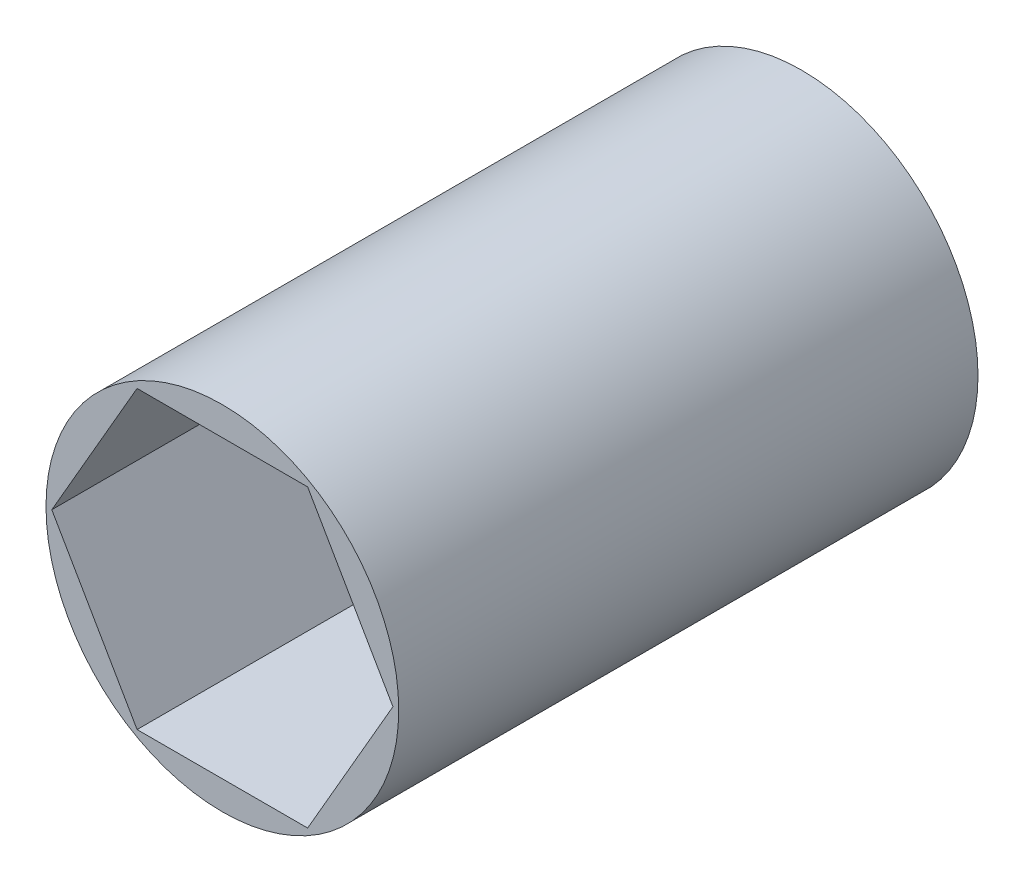
ISO-10303-21;
HEADER;
FILE_DESCRIPTION(('STEP AP214'),'2;1');
FILE_NAME('part.step','',(''),(''),'','','');
FILE_SCHEMA(('AUTOMOTIVE_DESIGN { 1 0 10303 214 1 1 1 1 }'));
ENDSEC;
DATA;
#1=APPLICATION_CONTEXT('core data for automotive mechanical design processes');
#2=APPLICATION_PROTOCOL_DEFINITION('international standard','automotive_design',2000,#1);
#3=PRODUCT_CONTEXT('',#1,'mechanical');
#4=PRODUCT('Part','Part','',(#3));
#5=PRODUCT_RELATED_PRODUCT_CATEGORY('part','',(#4));
#6=PRODUCT_DEFINITION_FORMATION('','',#4);
#7=PRODUCT_DEFINITION_CONTEXT('part definition',#1,'design');
#8=PRODUCT_DEFINITION('design','',#6,#7);
#9=PRODUCT_DEFINITION_SHAPE('','',#8);
#10=(LENGTH_UNIT() NAMED_UNIT(*) SI_UNIT(.MILLI.,.METRE.));
#11=(NAMED_UNIT(*) PLANE_ANGLE_UNIT() SI_UNIT($,.RADIAN.));
#12=(NAMED_UNIT(*) SI_UNIT($,.STERADIAN.) SOLID_ANGLE_UNIT());
#13=UNCERTAINTY_MEASURE_WITH_UNIT(LENGTH_MEASURE(1.E-05),#10,'distance_accuracy_value','');
#14=(GEOMETRIC_REPRESENTATION_CONTEXT(3) GLOBAL_UNCERTAINTY_ASSIGNED_CONTEXT((#13)) GLOBAL_UNIT_ASSIGNED_CONTEXT((#10,
#11,#12)) REPRESENTATION_CONTEXT('',''));
#15=CARTESIAN_POINT('',(0.,0.,0.));
#16=DIRECTION('',(0.,0.,1.));
#17=DIRECTION('',(1.,0.,0.));
#18=AXIS2_PLACEMENT_3D('',#15,#16,#17);
#19=CARTESIAN_POINT('',(0.,0.,-12.7));
#20=DIRECTION('',(0.,0.,1.));
#21=DIRECTION('',(1.,0.,0.));
#22=AXIS2_PLACEMENT_3D('',#19,#20,#21);
#23=PLANE('',#22);
#24=DIRECTION('',(1.,0.,0.));
#25=VECTOR('',#24,1.);
#26=CARTESIAN_POINT('',(-3.7394976935412,-6.477,-12.7));
#27=LINE('',#26,#25);
#28=CARTESIAN_POINT('',(-3.7394976935412,-6.477,-12.7));
#29=VERTEX_POINT('',#28);
#30=CARTESIAN_POINT('',(3.73949769354121,-6.477,-12.7));
#31=VERTEX_POINT('',#30);
#32=EDGE_CURVE('E158',#29,#31,#27,.T.);
#33=ORIENTED_EDGE('',*,*,#32,.T.);
#34=DIRECTION('',(0.5,0.866025403784439,0.));
#35=VECTOR('',#34,1.);
#36=CARTESIAN_POINT('',(3.73949769354121,-6.477,-12.7));
#37=LINE('',#36,#35);
#38=CARTESIAN_POINT('',(7.47899538708241,0.,-12.7));
#39=VERTEX_POINT('',#38);
#40=EDGE_CURVE('E53',#31,#39,#37,.T.);
#41=ORIENTED_EDGE('',*,*,#40,.T.);
#42=DIRECTION('',(-0.5,0.866025403784439,0.));
#43=VECTOR('',#42,1.);
#44=CARTESIAN_POINT('',(7.47899538708241,0.,-12.7));
#45=LINE('',#44,#43);
#46=CARTESIAN_POINT('',(3.7394976935412,6.477,-12.7));
#47=VERTEX_POINT('',#46);
#48=EDGE_CURVE('E170',#39,#47,#45,.T.);
#49=ORIENTED_EDGE('',*,*,#48,.T.);
#50=DIRECTION('',(-1.,0.,0.));
#51=VECTOR('',#50,1.);
#52=CARTESIAN_POINT('',(3.7394976935412,6.477,-12.7));
#53=LINE('',#52,#51);
#54=CARTESIAN_POINT('',(-3.73949769354121,6.477,-12.7));
#55=VERTEX_POINT('',#54);
#56=EDGE_CURVE('E176',#47,#55,#53,.T.);
#57=ORIENTED_EDGE('',*,*,#56,.T.);
#58=DIRECTION('',(-0.5,-0.866025403784439,0.));
#59=VECTOR('',#58,1.);
#60=CARTESIAN_POINT('',(-3.73949769354121,6.477,-12.7));
#61=LINE('',#60,#59);
#62=CARTESIAN_POINT('',(-7.47899538708241,0.,-12.7));
#63=VERTEX_POINT('',#62);
#64=EDGE_CURVE('E126',#55,#63,#61,.T.);
#65=ORIENTED_EDGE('',*,*,#64,.T.);
#66=DIRECTION('',(0.5,-0.866025403784439,0.));
#67=VECTOR('',#66,1.);
#68=CARTESIAN_POINT('',(-7.47899538708241,0.,-12.7));
#69=LINE('',#68,#67);
#70=EDGE_CURVE('E152',#63,#29,#69,.T.);
#71=ORIENTED_EDGE('',*,*,#70,.T.);
#72=EDGE_LOOP('',(#33,#41,#49,#57,#65,#71));
#73=FACE_BOUND('',#72,.T.);
#74=CARTESIAN_POINT('',(0.,0.,-12.7));
#75=DIRECTION('',(0.,0.,1.));
#76=DIRECTION('',(1.,0.,0.));
#77=AXIS2_PLACEMENT_3D('',#74,#75,#76);
#78=CIRCLE('',#77,7.73299538708241);
#79=CARTESIAN_POINT('',(7.73299538708241,0.,-12.7));
#80=VERTEX_POINT('',#79);
#81=EDGE_CURVE('E188',#80,#80,#78,.T.);
#82=ORIENTED_EDGE('',*,*,#81,.F.);
#83=EDGE_LOOP('',(#82));
#84=FACE_BOUND('',#83,.T.);
#85=ADVANCED_FACE('F49',(#73,#84),#23,.F.);
#86=CARTESIAN_POINT('',(0.,0.,12.7));
#87=DIRECTION('',(0.,0.,1.));
#88=DIRECTION('',(1.,0.,0.));
#89=AXIS2_PLACEMENT_3D('',#86,#87,#88);
#90=PLANE('',#89);
#91=DIRECTION('',(0.5,0.866025403784439,0.));
#92=VECTOR('',#91,1.);
#93=CARTESIAN_POINT('',(3.73949769354121,-6.477,12.7));
#94=LINE('',#93,#92);
#95=CARTESIAN_POINT('',(3.73949769354121,-6.477,12.7));
#96=VERTEX_POINT('',#95);
#97=CARTESIAN_POINT('',(7.47899538708241,0.,12.7));
#98=VERTEX_POINT('',#97);
#99=EDGE_CURVE('E179',#96,#98,#94,.T.);
#100=ORIENTED_EDGE('',*,*,#99,.F.);
#101=DIRECTION('',(1.,0.,0.));
#102=VECTOR('',#101,1.);
#103=CARTESIAN_POINT('',(-3.7394976935412,-6.477,12.7));
#104=LINE('',#103,#102);
#105=CARTESIAN_POINT('',(-3.7394976935412,-6.477,12.7));
#106=VERTEX_POINT('',#105);
#107=EDGE_CURVE('E148',#106,#96,#104,.T.);
#108=ORIENTED_EDGE('',*,*,#107,.F.);
#109=DIRECTION('',(0.5,-0.866025403784439,0.));
#110=VECTOR('',#109,1.);
#111=CARTESIAN_POINT('',(-7.47899538708241,0.,12.7));
#112=LINE('',#111,#110);
#113=CARTESIAN_POINT('',(-7.47899538708242,0.,12.7));
#114=VERTEX_POINT('',#113);
#115=EDGE_CURVE('E143',#114,#106,#112,.T.);
#116=ORIENTED_EDGE('',*,*,#115,.F.);
#117=DIRECTION('',(-0.5,-0.866025403784439,0.));
#118=VECTOR('',#117,1.);
#119=CARTESIAN_POINT('',(-3.73949769354121,6.477,12.7));
#120=LINE('',#119,#118);
#121=CARTESIAN_POINT('',(-3.73949769354121,6.477,12.7));
#122=VERTEX_POINT('',#121);
#123=EDGE_CURVE('E123',#122,#114,#120,.T.);
#124=ORIENTED_EDGE('',*,*,#123,.F.);
#125=DIRECTION('',(-1.,0.,0.));
#126=VECTOR('',#125,1.);
#127=CARTESIAN_POINT('',(3.7394976935412,6.477,12.7));
#128=LINE('',#127,#126);
#129=CARTESIAN_POINT('',(3.7394976935412,6.477,12.7));
#130=VERTEX_POINT('',#129);
#131=EDGE_CURVE('E131',#130,#122,#128,.T.);
#132=ORIENTED_EDGE('',*,*,#131,.F.);
#133=DIRECTION('',(-0.5,0.866025403784439,0.));
#134=VECTOR('',#133,1.);
#135=CARTESIAN_POINT('',(7.47899538708241,0.,12.7));
#136=LINE('',#135,#134);
#137=EDGE_CURVE('E136',#98,#130,#136,.T.);
#138=ORIENTED_EDGE('',*,*,#137,.F.);
#139=EDGE_LOOP('',(#100,#108,#116,#124,#132,#138));
#140=FACE_BOUND('',#139,.T.);
#141=CARTESIAN_POINT('',(0.,0.,12.7));
#142=DIRECTION('',(0.,0.,1.));
#143=DIRECTION('',(1.,0.,0.));
#144=AXIS2_PLACEMENT_3D('',#141,#142,#143);
#145=CIRCLE('',#144,7.73299538708241);
#146=CARTESIAN_POINT('',(7.73299538708241,0.,12.7));
#147=VERTEX_POINT('',#146);
#148=EDGE_CURVE('E199',#147,#147,#145,.T.);
#149=ORIENTED_EDGE('',*,*,#148,.T.);
#150=EDGE_LOOP('',(#149));
#151=FACE_BOUND('',#150,.T.);
#152=ADVANCED_FACE('F139',(#140,#151),#90,.T.);
#153=CARTESIAN_POINT('',(-7.47899538708241,0.,12.7));
#154=DIRECTION('',(0.866025403784439,0.5,0.));
#155=DIRECTION('',(0.,0.,-1.));
#156=AXIS2_PLACEMENT_3D('',#153,#154,#155);
#157=PLANE('',#156);
#158=ORIENTED_EDGE('',*,*,#70,.F.);
#159=DIRECTION('',(0.,0.,-1.));
#160=VECTOR('',#159,1.);
#161=CARTESIAN_POINT('',(-7.47899538708241,0.,12.7));
#162=LINE('',#161,#160);
#163=EDGE_CURVE('E11',#114,#63,#162,.T.);
#164=ORIENTED_EDGE('',*,*,#163,.F.);
#165=ORIENTED_EDGE('',*,*,#115,.T.);
#166=DIRECTION('',(0.,0.,-1.));
#167=VECTOR('',#166,1.);
#168=CARTESIAN_POINT('',(-3.7394976935412,-6.477,12.7));
#169=LINE('',#168,#167);
#170=EDGE_CURVE('E182',#106,#29,#169,.T.);
#171=ORIENTED_EDGE('',*,*,#170,.T.);
#172=EDGE_LOOP('',(#158,#164,#165,#171));
#173=FACE_BOUND('',#172,.T.);
#174=ADVANCED_FACE('F216',(#173),#157,.T.);
#175=CARTESIAN_POINT('',(-3.73949769354121,6.477,12.7));
#176=DIRECTION('',(0.866025403784439,-0.5,0.));
#177=DIRECTION('',(0.,0.,-1.));
#178=AXIS2_PLACEMENT_3D('',#175,#176,#177);
#179=PLANE('',#178);
#180=ORIENTED_EDGE('',*,*,#64,.F.);
#181=DIRECTION('',(0.,0.,-1.));
#182=VECTOR('',#181,1.);
#183=CARTESIAN_POINT('',(-3.73949769354121,6.477,12.7));
#184=LINE('',#183,#182);
#185=EDGE_CURVE('E60',#122,#55,#184,.T.);
#186=ORIENTED_EDGE('',*,*,#185,.F.);
#187=ORIENTED_EDGE('',*,*,#123,.T.);
#188=ORIENTED_EDGE('',*,*,#163,.T.);
#189=EDGE_LOOP('',(#180,#186,#187,#188));
#190=FACE_BOUND('',#189,.T.);
#191=ADVANCED_FACE('F51',(#190),#179,.T.);
#192=CARTESIAN_POINT('',(3.7394976935412,6.477,12.7));
#193=DIRECTION('',(0.,-1.,0.));
#194=DIRECTION('',(0.,0.,-1.));
#195=AXIS2_PLACEMENT_3D('',#192,#193,#194);
#196=PLANE('',#195);
#197=ORIENTED_EDGE('',*,*,#56,.F.);
#198=DIRECTION('',(0.,0.,-1.));
#199=VECTOR('',#198,1.);
#200=CARTESIAN_POINT('',(3.7394976935412,6.477,12.7));
#201=LINE('',#200,#199);
#202=EDGE_CURVE('E116',#130,#47,#201,.T.);
#203=ORIENTED_EDGE('',*,*,#202,.F.);
#204=ORIENTED_EDGE('',*,*,#131,.T.);
#205=ORIENTED_EDGE('',*,*,#185,.T.);
#206=EDGE_LOOP('',(#197,#203,#204,#205));
#207=FACE_BOUND('',#206,.T.);
#208=ADVANCED_FACE('F132',(#207),#196,.T.);
#209=CARTESIAN_POINT('',(7.47899538708241,0.,12.7));
#210=DIRECTION('',(-0.866025403784439,-0.5,0.));
#211=DIRECTION('',(-0.5,0.866025403784439,0.));
#212=AXIS2_PLACEMENT_3D('',#209,#210,#211);
#213=PLANE('',#212);
#214=ORIENTED_EDGE('',*,*,#48,.F.);
#215=DIRECTION('',(0.,0.,-1.));
#216=VECTOR('',#215,1.);
#217=CARTESIAN_POINT('',(7.47899538708241,0.,12.7));
#218=LINE('',#217,#216);
#219=EDGE_CURVE('E154',#98,#39,#218,.T.);
#220=ORIENTED_EDGE('',*,*,#219,.F.);
#221=ORIENTED_EDGE('',*,*,#137,.T.);
#222=ORIENTED_EDGE('',*,*,#202,.T.);
#223=EDGE_LOOP('',(#214,#220,#221,#222));
#224=FACE_BOUND('',#223,.T.);
#225=ADVANCED_FACE('F233',(#224),#213,.T.);
#226=CARTESIAN_POINT('',(3.73949769354121,-6.477,12.7));
#227=DIRECTION('',(-0.866025403784439,0.5,0.));
#228=DIRECTION('',(0.,0.,1.));
#229=AXIS2_PLACEMENT_3D('',#226,#227,#228);
#230=PLANE('',#229);
#231=ORIENTED_EDGE('',*,*,#40,.F.);
#232=DIRECTION('',(0.,0.,-1.));
#233=VECTOR('',#232,1.);
#234=CARTESIAN_POINT('',(3.73949769354121,-6.477,12.7));
#235=LINE('',#234,#233);
#236=EDGE_CURVE('E156',#96,#31,#235,.T.);
#237=ORIENTED_EDGE('',*,*,#236,.F.);
#238=ORIENTED_EDGE('',*,*,#99,.T.);
#239=ORIENTED_EDGE('',*,*,#219,.T.);
#240=EDGE_LOOP('',(#231,#237,#238,#239));
#241=FACE_BOUND('',#240,.T.);
#242=ADVANCED_FACE('F231',(#241),#230,.T.);
#243=CARTESIAN_POINT('',(-3.7394976935412,-6.477,12.7));
#244=DIRECTION('',(0.,1.,0.));
#245=DIRECTION('',(1.,0.,0.));
#246=AXIS2_PLACEMENT_3D('',#243,#244,#245);
#247=PLANE('',#246);
#248=ORIENTED_EDGE('',*,*,#32,.F.);
#249=ORIENTED_EDGE('',*,*,#170,.F.);
#250=ORIENTED_EDGE('',*,*,#107,.T.);
#251=ORIENTED_EDGE('',*,*,#236,.T.);
#252=EDGE_LOOP('',(#248,#249,#250,#251));
#253=FACE_BOUND('',#252,.T.);
#254=ADVANCED_FACE('F219',(#253),#247,.T.);
#255=CARTESIAN_POINT('',(0.,0.,-12.7));
#256=DIRECTION('',(0.,0.,1.));
#257=DIRECTION('',(1.,0.,0.));
#258=AXIS2_PLACEMENT_3D('',#255,#256,#257);
#259=CYLINDRICAL_SURFACE('',#258,7.73299538708241);
#260=ORIENTED_EDGE('',*,*,#81,.T.);
#261=EDGE_LOOP('',(#260));
#262=FACE_BOUND('',#261,.T.);
#263=ORIENTED_EDGE('',*,*,#148,.F.);
#264=EDGE_LOOP('',(#263));
#265=FACE_BOUND('',#264,.T.);
#266=ADVANCED_FACE('F207',(#262,#265),#259,.T.);
#267=CLOSED_SHELL('',(#85,#152,#174,#191,#208,#225,#242,#254,#266));
#268=MANIFOLD_SOLID_BREP('B2',#267);
#269=ADVANCED_BREP_SHAPE_REPRESENTATION('',(#18,#268),#14);
#270=SHAPE_DEFINITION_REPRESENTATION(#9,#269);
ENDSEC;
END-ISO-10303-21;
